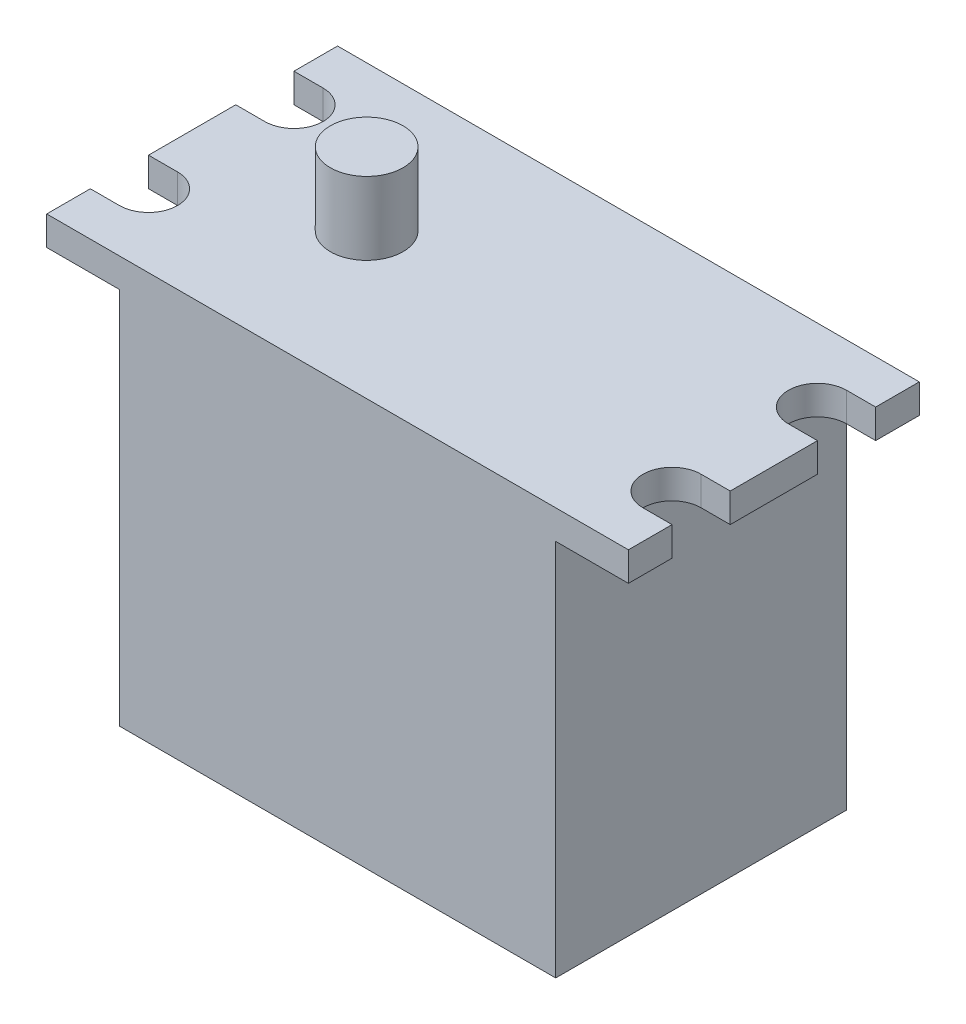
ISO-10303-21;
HEADER;
FILE_DESCRIPTION(('STEP AP214'),'2;1');
FILE_NAME('part.step','',(''),(''),'','','');
FILE_SCHEMA(('AUTOMOTIVE_DESIGN { 1 0 10303 214 1 1 1 1 }'));
ENDSEC;
DATA;
#1=APPLICATION_CONTEXT('core data for automotive mechanical design processes');
#2=APPLICATION_PROTOCOL_DEFINITION('international standard','automotive_design',2000,#1);
#3=PRODUCT_CONTEXT('',#1,'mechanical');
#4=PRODUCT('Part','Part','',(#3));
#5=PRODUCT_RELATED_PRODUCT_CATEGORY('part','',(#4));
#6=PRODUCT_DEFINITION_FORMATION('','',#4);
#7=PRODUCT_DEFINITION_CONTEXT('part definition',#1,'design');
#8=PRODUCT_DEFINITION('design','',#6,#7);
#9=PRODUCT_DEFINITION_SHAPE('','',#8);
#10=(LENGTH_UNIT() NAMED_UNIT(*) SI_UNIT(.MILLI.,.METRE.));
#11=(NAMED_UNIT(*) PLANE_ANGLE_UNIT() SI_UNIT($,.RADIAN.));
#12=(NAMED_UNIT(*) SI_UNIT($,.STERADIAN.) SOLID_ANGLE_UNIT());
#13=UNCERTAINTY_MEASURE_WITH_UNIT(LENGTH_MEASURE(1.E-05),#10,'distance_accuracy_value','');
#14=(GEOMETRIC_REPRESENTATION_CONTEXT(3) GLOBAL_UNCERTAINTY_ASSIGNED_CONTEXT((#13)) GLOBAL_UNIT_ASSIGNED_CONTEXT((#10,
#11,#12)) REPRESENTATION_CONTEXT('',''));
#15=CARTESIAN_POINT('',(0.,0.,0.));
#16=DIRECTION('',(0.,0.,1.));
#17=DIRECTION('',(1.,0.,0.));
#18=AXIS2_PLACEMENT_3D('',#15,#16,#17);
#19=CARTESIAN_POINT('',(12.7,17.78,6.35));
#20=DIRECTION('',(-1.,0.,0.));
#21=DIRECTION('',(0.,0.,1.));
#22=AXIS2_PLACEMENT_3D('',#19,#20,#21);
#23=PLANE('',#22);
#24=DIRECTION('',(0.,0.,-1.));
#25=VECTOR('',#24,1.);
#26=CARTESIAN_POINT('',(12.7,17.78,6.35));
#27=LINE('',#26,#25);
#28=CARTESIAN_POINT('',(12.7,17.78,1.905));
#29=VERTEX_POINT('',#28);
#30=CARTESIAN_POINT('',(12.7,17.78,-1.905));
#31=VERTEX_POINT('',#30);
#32=EDGE_CURVE('E321',#29,#31,#27,.T.);
#33=ORIENTED_EDGE('',*,*,#32,.F.);
#34=DIRECTION('',(0.,1.,0.));
#35=VECTOR('',#34,1.);
#36=CARTESIAN_POINT('',(12.7,0.,1.905));
#37=LINE('',#36,#35);
#38=CARTESIAN_POINT('',(12.7,16.51,1.905));
#39=VERTEX_POINT('',#38);
#40=EDGE_CURVE('E253',#39,#29,#37,.T.);
#41=ORIENTED_EDGE('',*,*,#40,.F.);
#42=DIRECTION('',(0.,0.,1.));
#43=VECTOR('',#42,1.);
#44=CARTESIAN_POINT('',(12.7,16.51,-6.35));
#45=LINE('',#44,#43);
#46=CARTESIAN_POINT('',(12.7,16.51,-1.905));
#47=VERTEX_POINT('',#46);
#48=EDGE_CURVE('E303',#47,#39,#45,.T.);
#49=ORIENTED_EDGE('',*,*,#48,.F.);
#50=DIRECTION('',(0.,1.,0.));
#51=VECTOR('',#50,1.);
#52=CARTESIAN_POINT('',(12.7,0.,-1.905));
#53=LINE('',#52,#51);
#54=EDGE_CURVE('E56',#47,#31,#53,.T.);
#55=ORIENTED_EDGE('',*,*,#54,.T.);
#56=EDGE_LOOP('',(#33,#41,#49,#55));
#57=FACE_BOUND('',#56,.T.);
#58=ADVANCED_FACE('F33',(#57),#23,.F.);
#59=CARTESIAN_POINT('',(12.7,17.78,-4.445));
#60=VERTEX_POINT('',#59);
#61=CARTESIAN_POINT('',(12.7,17.78,-6.35));
#62=VERTEX_POINT('',#61);
#63=EDGE_CURVE('E322',#60,#62,#27,.T.);
#64=ORIENTED_EDGE('',*,*,#63,.F.);
#65=DIRECTION('',(0.,1.,0.));
#66=VECTOR('',#65,1.);
#67=CARTESIAN_POINT('',(12.7,0.,-4.445));
#68=LINE('',#67,#66);
#69=CARTESIAN_POINT('',(12.7,16.51,-4.445));
#70=VERTEX_POINT('',#69);
#71=EDGE_CURVE('E239',#70,#60,#68,.T.);
#72=ORIENTED_EDGE('',*,*,#71,.F.);
#73=CARTESIAN_POINT('',(12.7,16.51,-6.35));
#74=VERTEX_POINT('',#73);
#75=EDGE_CURVE('E299',#74,#70,#45,.T.);
#76=ORIENTED_EDGE('',*,*,#75,.F.);
#77=DIRECTION('',(0.,-1.,0.));
#78=VECTOR('',#77,1.);
#79=CARTESIAN_POINT('',(12.7,17.78,-6.35));
#80=LINE('',#79,#78);
#81=EDGE_CURVE('E343',#62,#74,#80,.T.);
#82=ORIENTED_EDGE('',*,*,#81,.F.);
#83=EDGE_LOOP('',(#64,#72,#76,#82));
#84=FACE_BOUND('',#83,.T.);
#85=ADVANCED_FACE('F430',(#84),#23,.F.);
#86=CARTESIAN_POINT('',(-12.7,17.78,6.35));
#87=DIRECTION('',(1.,0.,0.));
#88=DIRECTION('',(0.,0.,-1.));
#89=AXIS2_PLACEMENT_3D('',#86,#87,#88);
#90=PLANE('',#89);
#91=DIRECTION('',(0.,0.,1.));
#92=VECTOR('',#91,1.);
#93=CARTESIAN_POINT('',(-12.7,17.78,6.35));
#94=LINE('',#93,#92);
#95=CARTESIAN_POINT('',(-12.7,17.78,-1.905));
#96=VERTEX_POINT('',#95);
#97=CARTESIAN_POINT('',(-12.7,17.78,1.905));
#98=VERTEX_POINT('',#97);
#99=EDGE_CURVE('E327',#96,#98,#94,.T.);
#100=ORIENTED_EDGE('',*,*,#99,.F.);
#101=DIRECTION('',(0.,1.,0.));
#102=VECTOR('',#101,1.);
#103=CARTESIAN_POINT('',(-12.7,0.,-1.905));
#104=LINE('',#103,#102);
#105=CARTESIAN_POINT('',(-12.7,16.51,-1.905));
#106=VERTEX_POINT('',#105);
#107=EDGE_CURVE('E225',#106,#96,#104,.T.);
#108=ORIENTED_EDGE('',*,*,#107,.F.);
#109=DIRECTION('',(0.,0.,-1.));
#110=VECTOR('',#109,1.);
#111=CARTESIAN_POINT('',(-12.7,16.51,-6.35));
#112=LINE('',#111,#110);
#113=CARTESIAN_POINT('',(-12.7,16.51,1.905));
#114=VERTEX_POINT('',#113);
#115=EDGE_CURVE('E281',#114,#106,#112,.T.);
#116=ORIENTED_EDGE('',*,*,#115,.F.);
#117=DIRECTION('',(0.,1.,0.));
#118=VECTOR('',#117,1.);
#119=CARTESIAN_POINT('',(-12.7,0.,1.905));
#120=LINE('',#119,#118);
#121=EDGE_CURVE('E270',#114,#98,#120,.T.);
#122=ORIENTED_EDGE('',*,*,#121,.T.);
#123=EDGE_LOOP('',(#100,#108,#116,#122));
#124=FACE_BOUND('',#123,.T.);
#125=ADVANCED_FACE('F447',(#124),#90,.F.);
#126=CARTESIAN_POINT('',(-12.7,17.78,4.445));
#127=VERTEX_POINT('',#126);
#128=CARTESIAN_POINT('',(-12.7,17.78,6.35));
#129=VERTEX_POINT('',#128);
#130=EDGE_CURVE('E324',#127,#129,#94,.T.);
#131=ORIENTED_EDGE('',*,*,#130,.F.);
#132=DIRECTION('',(0.,1.,0.));
#133=VECTOR('',#132,1.);
#134=CARTESIAN_POINT('',(-12.7,0.,4.445));
#135=LINE('',#134,#133);
#136=CARTESIAN_POINT('',(-12.7,16.51,4.445));
#137=VERTEX_POINT('',#136);
#138=EDGE_CURVE('E268',#137,#127,#135,.T.);
#139=ORIENTED_EDGE('',*,*,#138,.F.);
#140=CARTESIAN_POINT('',(-12.7,16.51,6.35));
#141=VERTEX_POINT('',#140);
#142=EDGE_CURVE('E277',#141,#137,#112,.T.);
#143=ORIENTED_EDGE('',*,*,#142,.F.);
#144=DIRECTION('',(0.,-1.,0.));
#145=VECTOR('',#144,1.);
#146=CARTESIAN_POINT('',(-12.7,17.78,6.35));
#147=LINE('',#146,#145);
#148=EDGE_CURVE('E337',#129,#141,#147,.T.);
#149=ORIENTED_EDGE('',*,*,#148,.F.);
#150=EDGE_LOOP('',(#131,#139,#143,#149));
#151=FACE_BOUND('',#150,.T.);
#152=ADVANCED_FACE('F403',(#151),#90,.F.);
#153=CARTESIAN_POINT('',(12.7,16.51,4.445));
#154=VERTEX_POINT('',#153);
#155=CARTESIAN_POINT('',(12.7,16.51,6.35));
#156=VERTEX_POINT('',#155);
#157=EDGE_CURVE('E304',#154,#156,#45,.T.);
#158=ORIENTED_EDGE('',*,*,#157,.F.);
#159=DIRECTION('',(0.,1.,0.));
#160=VECTOR('',#159,1.);
#161=CARTESIAN_POINT('',(12.7,0.,4.445));
#162=LINE('',#161,#160);
#163=CARTESIAN_POINT('',(12.7,17.78,4.445));
#164=VERTEX_POINT('',#163);
#165=EDGE_CURVE('E48',#154,#164,#162,.T.);
#166=ORIENTED_EDGE('',*,*,#165,.T.);
#167=CARTESIAN_POINT('',(12.7,17.78,6.35));
#168=VERTEX_POINT('',#167);
#169=EDGE_CURVE('E317',#168,#164,#27,.T.);
#170=ORIENTED_EDGE('',*,*,#169,.F.);
#171=DIRECTION('',(0.,-1.,0.));
#172=VECTOR('',#171,1.);
#173=CARTESIAN_POINT('',(12.7,17.78,6.35));
#174=LINE('',#173,#172);
#175=EDGE_CURVE('E329',#168,#156,#174,.T.);
#176=ORIENTED_EDGE('',*,*,#175,.T.);
#177=EDGE_LOOP('',(#158,#166,#170,#176));
#178=FACE_BOUND('',#177,.T.);
#179=ADVANCED_FACE('F35',(#178),#23,.F.);
#180=CARTESIAN_POINT('',(-12.7,17.78,-6.35));
#181=DIRECTION('',(0.,0.,1.));
#182=DIRECTION('',(1.,0.,0.));
#183=AXIS2_PLACEMENT_3D('',#180,#181,#182);
#184=PLANE('',#183);
#185=DIRECTION('',(-1.,0.,0.));
#186=VECTOR('',#185,1.);
#187=CARTESIAN_POINT('',(-12.7,0.,-6.35));
#188=LINE('',#187,#186);
#189=CARTESIAN_POINT('',(9.525,0.,-6.35));
#190=VERTEX_POINT('',#189);
#191=CARTESIAN_POINT('',(-9.525,0.,-6.35));
#192=VERTEX_POINT('',#191);
#193=EDGE_CURVE('E297',#190,#192,#188,.T.);
#194=ORIENTED_EDGE('',*,*,#193,.T.);
#195=DIRECTION('',(0.,-1.,0.));
#196=VECTOR('',#195,1.);
#197=CARTESIAN_POINT('',(-9.525,16.51,-6.35));
#198=LINE('',#197,#196);
#199=CARTESIAN_POINT('',(-9.525,16.51,-6.35));
#200=VERTEX_POINT('',#199);
#201=EDGE_CURVE('E290',#200,#192,#198,.T.);
#202=ORIENTED_EDGE('',*,*,#201,.F.);
#203=DIRECTION('',(1.,0.,0.));
#204=VECTOR('',#203,1.);
#205=CARTESIAN_POINT('',(-12.7,16.51,-6.35));
#206=LINE('',#205,#204);
#207=CARTESIAN_POINT('',(-12.7,16.51,-6.35));
#208=VERTEX_POINT('',#207);
#209=EDGE_CURVE('E280',#208,#200,#206,.T.);
#210=ORIENTED_EDGE('',*,*,#209,.F.);
#211=DIRECTION('',(0.,-1.,0.));
#212=VECTOR('',#211,1.);
#213=CARTESIAN_POINT('',(-12.7,17.78,-6.35));
#214=LINE('',#213,#212);
#215=CARTESIAN_POINT('',(-12.7,17.78,-6.35));
#216=VERTEX_POINT('',#215);
#217=EDGE_CURVE('E340',#216,#208,#214,.T.);
#218=ORIENTED_EDGE('',*,*,#217,.F.);
#219=DIRECTION('',(-1.,0.,0.));
#220=VECTOR('',#219,1.);
#221=CARTESIAN_POINT('',(-12.7,17.78,-6.35));
#222=LINE('',#221,#220);
#223=EDGE_CURVE('E320',#62,#216,#222,.T.);
#224=ORIENTED_EDGE('',*,*,#223,.F.);
#225=ORIENTED_EDGE('',*,*,#81,.T.);
#226=DIRECTION('',(1.,0.,0.));
#227=VECTOR('',#226,1.);
#228=CARTESIAN_POINT('',(12.7,16.51,-6.35));
#229=LINE('',#228,#227);
#230=CARTESIAN_POINT('',(9.525,16.51,-6.35));
#231=VERTEX_POINT('',#230);
#232=EDGE_CURVE('E310',#231,#74,#229,.T.);
#233=ORIENTED_EDGE('',*,*,#232,.F.);
#234=DIRECTION('',(0.,-1.,0.));
#235=VECTOR('',#234,1.);
#236=CARTESIAN_POINT('',(9.525,16.51,-6.35));
#237=LINE('',#236,#235);
#238=EDGE_CURVE('E293',#231,#190,#237,.T.);
#239=ORIENTED_EDGE('',*,*,#238,.T.);
#240=EDGE_LOOP('',(#194,#202,#210,#218,#224,#225,#233,#239));
#241=FACE_BOUND('',#240,.T.);
#242=ADVANCED_FACE('F422',(#241),#184,.F.);
#243=CARTESIAN_POINT('',(-12.7,16.51,-4.445));
#244=VERTEX_POINT('',#243);
#245=EDGE_CURVE('E282',#244,#208,#112,.T.);
#246=ORIENTED_EDGE('',*,*,#245,.F.);
#247=DIRECTION('',(0.,1.,0.));
#248=VECTOR('',#247,1.);
#249=CARTESIAN_POINT('',(-12.7,0.,-4.445));
#250=LINE('',#249,#248);
#251=CARTESIAN_POINT('',(-12.7,17.78,-4.445));
#252=VERTEX_POINT('',#251);
#253=EDGE_CURVE('E202',#244,#252,#250,.T.);
#254=ORIENTED_EDGE('',*,*,#253,.T.);
#255=EDGE_CURVE('E219',#216,#252,#94,.T.);
#256=ORIENTED_EDGE('',*,*,#255,.F.);
#257=ORIENTED_EDGE('',*,*,#217,.T.);
#258=EDGE_LOOP('',(#246,#254,#256,#257));
#259=FACE_BOUND('',#258,.T.);
#260=ADVANCED_FACE('F453',(#259),#90,.F.);
#261=CARTESIAN_POINT('',(-12.7,17.78,6.35));
#262=DIRECTION('',(0.,0.,-1.));
#263=DIRECTION('',(-1.,0.,0.));
#264=AXIS2_PLACEMENT_3D('',#261,#262,#263);
#265=PLANE('',#264);
#266=DIRECTION('',(-1.,0.,0.));
#267=VECTOR('',#266,1.);
#268=CARTESIAN_POINT('',(-12.7,16.51,6.35));
#269=LINE('',#268,#267);
#270=CARTESIAN_POINT('',(-9.525,16.51,6.35));
#271=VERTEX_POINT('',#270);
#272=EDGE_CURVE('E288',#271,#141,#269,.T.);
#273=ORIENTED_EDGE('',*,*,#272,.F.);
#274=DIRECTION('',(0.,-1.,0.));
#275=VECTOR('',#274,1.);
#276=CARTESIAN_POINT('',(-9.525,16.51,6.35));
#277=LINE('',#276,#275);
#278=CARTESIAN_POINT('',(-9.525,0.,6.35));
#279=VERTEX_POINT('',#278);
#280=EDGE_CURVE('E294',#271,#279,#277,.T.);
#281=ORIENTED_EDGE('',*,*,#280,.T.);
#282=DIRECTION('',(1.,0.,0.));
#283=VECTOR('',#282,1.);
#284=CARTESIAN_POINT('',(-12.7,0.,6.35));
#285=LINE('',#284,#283);
#286=CARTESIAN_POINT('',(9.525,0.,6.35));
#287=VERTEX_POINT('',#286);
#288=EDGE_CURVE('E332',#279,#287,#285,.T.);
#289=ORIENTED_EDGE('',*,*,#288,.T.);
#290=DIRECTION('',(0.,-1.,0.));
#291=VECTOR('',#290,1.);
#292=CARTESIAN_POINT('',(9.525,16.51,6.35));
#293=LINE('',#292,#291);
#294=CARTESIAN_POINT('',(9.525,16.51,6.35));
#295=VERTEX_POINT('',#294);
#296=EDGE_CURVE('E312',#295,#287,#293,.T.);
#297=ORIENTED_EDGE('',*,*,#296,.F.);
#298=DIRECTION('',(-1.,0.,0.));
#299=VECTOR('',#298,1.);
#300=CARTESIAN_POINT('',(12.7,16.51,6.35));
#301=LINE('',#300,#299);
#302=EDGE_CURVE('E302',#156,#295,#301,.T.);
#303=ORIENTED_EDGE('',*,*,#302,.F.);
#304=ORIENTED_EDGE('',*,*,#175,.F.);
#305=DIRECTION('',(1.,0.,0.));
#306=VECTOR('',#305,1.);
#307=CARTESIAN_POINT('',(-12.7,17.78,6.35));
#308=LINE('',#307,#306);
#309=EDGE_CURVE('E326',#129,#168,#308,.T.);
#310=ORIENTED_EDGE('',*,*,#309,.F.);
#311=ORIENTED_EDGE('',*,*,#148,.T.);
#312=EDGE_LOOP('',(#273,#281,#289,#297,#303,#304,#310,#311));
#313=FACE_BOUND('',#312,.T.);
#314=ADVANCED_FACE('F394',(#313),#265,.F.);
#315=CARTESIAN_POINT('',(0.,17.78,0.));
#316=DIRECTION('',(0.,-1.,0.));
#317=DIRECTION('',(0.,0.,-1.));
#318=AXIS2_PLACEMENT_3D('',#315,#316,#317);
#319=PLANE('',#318);
#320=CARTESIAN_POINT('',(-5.08,17.78,0.));
#321=DIRECTION('',(0.,-1.,0.));
#322=DIRECTION('',(0.,0.,-1.));
#323=AXIS2_PLACEMENT_3D('',#320,#321,#322);
#324=CIRCLE('',#323,1.5875);
#325=CARTESIAN_POINT('',(-5.08,17.78,-1.5875));
#326=VERTEX_POINT('',#325);
#327=EDGE_CURVE('E346',#326,#326,#324,.F.);
#328=ORIENTED_EDGE('',*,*,#327,.F.);
#329=EDGE_LOOP('',(#328));
#330=FACE_BOUND('',#329,.T.);
#331=CARTESIAN_POINT('',(11.43,17.78,3.175));
#332=DIRECTION('',(0.,1.,0.));
#333=DIRECTION('',(0.,0.,-1.));
#334=AXIS2_PLACEMENT_3D('',#331,#332,#333);
#335=CIRCLE('',#334,1.27);
#336=CARTESIAN_POINT('',(11.43,17.78,1.905));
#337=VERTEX_POINT('',#336);
#338=CARTESIAN_POINT('',(11.43,17.78,4.445));
#339=VERTEX_POINT('',#338);
#340=EDGE_CURVE('E243',#337,#339,#335,.T.);
#341=ORIENTED_EDGE('',*,*,#340,.F.);
#342=DIRECTION('',(-1.,0.,0.));
#343=VECTOR('',#342,1.);
#344=CARTESIAN_POINT('',(12.7,17.78,1.905));
#345=LINE('',#344,#343);
#346=EDGE_CURVE('E248',#29,#337,#345,.T.);
#347=ORIENTED_EDGE('',*,*,#346,.F.);
#348=ORIENTED_EDGE('',*,*,#32,.T.);
#349=DIRECTION('',(1.,0.,0.));
#350=VECTOR('',#349,1.);
#351=CARTESIAN_POINT('',(11.43,17.78,-1.905));
#352=LINE('',#351,#350);
#353=CARTESIAN_POINT('',(11.43,17.78,-1.905));
#354=VERTEX_POINT('',#353);
#355=EDGE_CURVE('E231',#354,#31,#352,.T.);
#356=ORIENTED_EDGE('',*,*,#355,.F.);
#357=CARTESIAN_POINT('',(11.43,17.78,-3.175));
#358=DIRECTION('',(0.,1.,0.));
#359=DIRECTION('',(0.,0.,-1.));
#360=AXIS2_PLACEMENT_3D('',#357,#358,#359);
#361=CIRCLE('',#360,1.27);
#362=CARTESIAN_POINT('',(11.43,17.78,-4.445));
#363=VERTEX_POINT('',#362);
#364=EDGE_CURVE('E228',#363,#354,#361,.T.);
#365=ORIENTED_EDGE('',*,*,#364,.F.);
#366=DIRECTION('',(-1.,0.,0.));
#367=VECTOR('',#366,1.);
#368=CARTESIAN_POINT('',(12.7,17.78,-4.445));
#369=LINE('',#368,#367);
#370=EDGE_CURVE('E234',#60,#363,#369,.T.);
#371=ORIENTED_EDGE('',*,*,#370,.F.);
#372=ORIENTED_EDGE('',*,*,#63,.T.);
#373=ORIENTED_EDGE('',*,*,#223,.T.);
#374=ORIENTED_EDGE('',*,*,#255,.T.);
#375=DIRECTION('',(-1.,0.,0.));
#376=VECTOR('',#375,1.);
#377=CARTESIAN_POINT('',(-12.7,17.78,-4.445));
#378=LINE('',#377,#376);
#379=CARTESIAN_POINT('',(-11.43,17.78,-4.445));
#380=VERTEX_POINT('',#379);
#381=EDGE_CURVE('E196',#380,#252,#378,.T.);
#382=ORIENTED_EDGE('',*,*,#381,.F.);
#383=CARTESIAN_POINT('',(-11.43,17.78,-3.175));
#384=DIRECTION('',(0.,1.,0.));
#385=DIRECTION('',(0.,0.,1.));
#386=AXIS2_PLACEMENT_3D('',#383,#384,#385);
#387=CIRCLE('',#386,1.27);
#388=CARTESIAN_POINT('',(-11.43,17.78,-1.905));
#389=VERTEX_POINT('',#388);
#390=EDGE_CURVE('E206',#389,#380,#387,.T.);
#391=ORIENTED_EDGE('',*,*,#390,.F.);
#392=DIRECTION('',(1.,0.,0.));
#393=VECTOR('',#392,1.);
#394=CARTESIAN_POINT('',(-11.43,17.78,-1.905));
#395=LINE('',#394,#393);
#396=EDGE_CURVE('E203',#96,#389,#395,.T.);
#397=ORIENTED_EDGE('',*,*,#396,.F.);
#398=ORIENTED_EDGE('',*,*,#99,.T.);
#399=DIRECTION('',(-1.,0.,0.));
#400=VECTOR('',#399,1.);
#401=CARTESIAN_POINT('',(-12.7,17.78,1.905));
#402=LINE('',#401,#400);
#403=CARTESIAN_POINT('',(-11.43,17.78,1.905));
#404=VERTEX_POINT('',#403);
#405=EDGE_CURVE('E259',#404,#98,#402,.T.);
#406=ORIENTED_EDGE('',*,*,#405,.F.);
#407=CARTESIAN_POINT('',(-11.43,17.78,3.175));
#408=DIRECTION('',(0.,1.,0.));
#409=DIRECTION('',(0.,0.,1.));
#410=AXIS2_PLACEMENT_3D('',#407,#408,#409);
#411=CIRCLE('',#410,1.27);
#412=CARTESIAN_POINT('',(-11.43,17.78,4.445));
#413=VERTEX_POINT('',#412);
#414=EDGE_CURVE('E224',#413,#404,#411,.T.);
#415=ORIENTED_EDGE('',*,*,#414,.F.);
#416=DIRECTION('',(1.,0.,0.));
#417=VECTOR('',#416,1.);
#418=CARTESIAN_POINT('',(-11.43,17.78,4.445));
#419=LINE('',#418,#417);
#420=EDGE_CURVE('E261',#127,#413,#419,.T.);
#421=ORIENTED_EDGE('',*,*,#420,.F.);
#422=ORIENTED_EDGE('',*,*,#130,.T.);
#423=ORIENTED_EDGE('',*,*,#309,.T.);
#424=ORIENTED_EDGE('',*,*,#169,.T.);
#425=DIRECTION('',(1.,0.,0.));
#426=VECTOR('',#425,1.);
#427=CARTESIAN_POINT('',(11.43,17.78,4.445));
#428=LINE('',#427,#426);
#429=EDGE_CURVE('E246',#339,#164,#428,.T.);
#430=ORIENTED_EDGE('',*,*,#429,.F.);
#431=EDGE_LOOP('',(#341,#347,#348,#356,#365,#371,#372,#373,#374,#382,#391,#397,#398,#406,#415,
#421,#422,#423,#424,#430));
#432=FACE_BOUND('',#431,.T.);
#433=ADVANCED_FACE('F217',(#330,#432),#319,.F.);
#434=CARTESIAN_POINT('',(0.,0.,0.));
#435=DIRECTION('',(0.,-1.,0.));
#436=DIRECTION('',(0.,0.,-1.));
#437=AXIS2_PLACEMENT_3D('',#434,#435,#436);
#438=PLANE('',#437);
#439=DIRECTION('',(0.,0.,1.));
#440=VECTOR('',#439,1.);
#441=CARTESIAN_POINT('',(-9.525,0.,-6.35));
#442=LINE('',#441,#440);
#443=EDGE_CURVE('E291',#192,#279,#442,.T.);
#444=ORIENTED_EDGE('',*,*,#443,.F.);
#445=ORIENTED_EDGE('',*,*,#193,.F.);
#446=DIRECTION('',(0.,0.,-1.));
#447=VECTOR('',#446,1.);
#448=CARTESIAN_POINT('',(9.525,0.,-6.35));
#449=LINE('',#448,#447);
#450=EDGE_CURVE('E276',#287,#190,#449,.T.);
#451=ORIENTED_EDGE('',*,*,#450,.F.);
#452=ORIENTED_EDGE('',*,*,#288,.F.);
#453=EDGE_LOOP('',(#444,#445,#451,#452));
#454=FACE_BOUND('',#453,.T.);
#455=ADVANCED_FACE('F416',(#454),#438,.T.);
#456=CARTESIAN_POINT('',(9.525,16.51,-6.35));
#457=DIRECTION('',(-1.,0.,0.));
#458=DIRECTION('',(0.,0.,1.));
#459=AXIS2_PLACEMENT_3D('',#456,#457,#458);
#460=PLANE('',#459);
#461=ORIENTED_EDGE('',*,*,#450,.T.);
#462=ORIENTED_EDGE('',*,*,#238,.F.);
#463=DIRECTION('',(0.,0.,-1.));
#464=VECTOR('',#463,1.);
#465=CARTESIAN_POINT('',(9.525,16.51,-6.35));
#466=LINE('',#465,#464);
#467=EDGE_CURVE('E307',#295,#231,#466,.T.);
#468=ORIENTED_EDGE('',*,*,#467,.F.);
#469=ORIENTED_EDGE('',*,*,#296,.T.);
#470=EDGE_LOOP('',(#461,#462,#468,#469));
#471=FACE_BOUND('',#470,.T.);
#472=ADVANCED_FACE('F419',(#471),#460,.F.);
#473=CARTESIAN_POINT('',(0.,16.51,0.));
#474=DIRECTION('',(0.,-1.,0.));
#475=DIRECTION('',(0.,0.,-1.));
#476=AXIS2_PLACEMENT_3D('',#473,#474,#475);
#477=PLANE('',#476);
#478=DIRECTION('',(1.,0.,0.));
#479=VECTOR('',#478,1.);
#480=CARTESIAN_POINT('',(0.,16.51,1.905));
#481=LINE('',#480,#479);
#482=CARTESIAN_POINT('',(11.43,16.51,1.905));
#483=VERTEX_POINT('',#482);
#484=EDGE_CURVE('E11',#483,#39,#481,.T.);
#485=ORIENTED_EDGE('',*,*,#484,.F.);
#486=CARTESIAN_POINT('',(11.43,16.51,3.175));
#487=DIRECTION('',(0.,-1.,0.));
#488=DIRECTION('',(0.,0.,-1.));
#489=AXIS2_PLACEMENT_3D('',#486,#487,#488);
#490=CIRCLE('',#489,1.27);
#491=CARTESIAN_POINT('',(11.43,16.51,4.445));
#492=VERTEX_POINT('',#491);
#493=EDGE_CURVE('E41',#492,#483,#490,.T.);
#494=ORIENTED_EDGE('',*,*,#493,.F.);
#495=DIRECTION('',(-1.,0.,0.));
#496=VECTOR('',#495,1.);
#497=CARTESIAN_POINT('',(0.,16.51,4.445));
#498=LINE('',#497,#496);
#499=EDGE_CURVE('E370',#154,#492,#498,.T.);
#500=ORIENTED_EDGE('',*,*,#499,.F.);
#501=ORIENTED_EDGE('',*,*,#157,.T.);
#502=ORIENTED_EDGE('',*,*,#302,.T.);
#503=ORIENTED_EDGE('',*,*,#467,.T.);
#504=ORIENTED_EDGE('',*,*,#232,.T.);
#505=ORIENTED_EDGE('',*,*,#75,.T.);
#506=DIRECTION('',(1.,0.,0.));
#507=VECTOR('',#506,1.);
#508=CARTESIAN_POINT('',(0.,16.51,-4.445));
#509=LINE('',#508,#507);
#510=CARTESIAN_POINT('',(11.43,16.51,-4.445));
#511=VERTEX_POINT('',#510);
#512=EDGE_CURVE('E368',#511,#70,#509,.T.);
#513=ORIENTED_EDGE('',*,*,#512,.F.);
#514=CARTESIAN_POINT('',(11.43,16.51,-3.175));
#515=DIRECTION('',(0.,-1.,0.));
#516=DIRECTION('',(0.,0.,-1.));
#517=AXIS2_PLACEMENT_3D('',#514,#515,#516);
#518=CIRCLE('',#517,1.27);
#519=CARTESIAN_POINT('',(11.43,16.51,-1.905));
#520=VERTEX_POINT('',#519);
#521=EDGE_CURVE('E366',#520,#511,#518,.T.);
#522=ORIENTED_EDGE('',*,*,#521,.F.);
#523=DIRECTION('',(-1.,0.,0.));
#524=VECTOR('',#523,1.);
#525=CARTESIAN_POINT('',(0.,16.51,-1.905));
#526=LINE('',#525,#524);
#527=EDGE_CURVE('E364',#47,#520,#526,.T.);
#528=ORIENTED_EDGE('',*,*,#527,.F.);
#529=ORIENTED_EDGE('',*,*,#48,.T.);
#530=EDGE_LOOP('',(#485,#494,#500,#501,#502,#503,#504,#505,#513,#522,#528,#529));
#531=FACE_BOUND('',#530,.T.);
#532=ADVANCED_FACE('F383',(#531),#477,.T.);
#533=CARTESIAN_POINT('',(-9.525,16.51,-6.35));
#534=DIRECTION('',(1.,0.,0.));
#535=DIRECTION('',(0.,0.,-1.));
#536=AXIS2_PLACEMENT_3D('',#533,#534,#535);
#537=PLANE('',#536);
#538=ORIENTED_EDGE('',*,*,#443,.T.);
#539=ORIENTED_EDGE('',*,*,#280,.F.);
#540=DIRECTION('',(0.,0.,1.));
#541=VECTOR('',#540,1.);
#542=CARTESIAN_POINT('',(-9.525,16.51,-6.35));
#543=LINE('',#542,#541);
#544=EDGE_CURVE('E285',#200,#271,#543,.T.);
#545=ORIENTED_EDGE('',*,*,#544,.F.);
#546=ORIENTED_EDGE('',*,*,#201,.T.);
#547=EDGE_LOOP('',(#538,#539,#545,#546));
#548=FACE_BOUND('',#547,.T.);
#549=ADVANCED_FACE('F411',(#548),#537,.F.);
#550=CARTESIAN_POINT('',(0.,16.51,0.));
#551=DIRECTION('',(0.,1.,0.));
#552=DIRECTION('',(0.,0.,1.));
#553=AXIS2_PLACEMENT_3D('',#550,#551,#552);
#554=PLANE('',#553);
#555=ORIENTED_EDGE('',*,*,#115,.T.);
#556=DIRECTION('',(1.,0.,0.));
#557=VECTOR('',#556,1.);
#558=CARTESIAN_POINT('',(0.,16.51,-1.905));
#559=LINE('',#558,#557);
#560=CARTESIAN_POINT('',(-11.43,16.51,-1.905));
#561=VERTEX_POINT('',#560);
#562=EDGE_CURVE('E361',#106,#561,#559,.T.);
#563=ORIENTED_EDGE('',*,*,#562,.T.);
#564=CARTESIAN_POINT('',(-11.43,16.51,-3.175));
#565=DIRECTION('',(0.,1.,0.));
#566=DIRECTION('',(0.,0.,1.));
#567=AXIS2_PLACEMENT_3D('',#564,#565,#566);
#568=CIRCLE('',#567,1.27);
#569=CARTESIAN_POINT('',(-11.43,16.51,-4.445));
#570=VERTEX_POINT('',#569);
#571=EDGE_CURVE('E359',#561,#570,#568,.T.);
#572=ORIENTED_EDGE('',*,*,#571,.T.);
#573=DIRECTION('',(-1.,0.,0.));
#574=VECTOR('',#573,1.);
#575=CARTESIAN_POINT('',(0.,16.51,-4.445));
#576=LINE('',#575,#574);
#577=EDGE_CURVE('E199',#570,#244,#576,.T.);
#578=ORIENTED_EDGE('',*,*,#577,.T.);
#579=ORIENTED_EDGE('',*,*,#245,.T.);
#580=ORIENTED_EDGE('',*,*,#209,.T.);
#581=ORIENTED_EDGE('',*,*,#544,.T.);
#582=ORIENTED_EDGE('',*,*,#272,.T.);
#583=ORIENTED_EDGE('',*,*,#142,.T.);
#584=DIRECTION('',(1.,0.,0.));
#585=VECTOR('',#584,1.);
#586=CARTESIAN_POINT('',(0.,16.51,4.445));
#587=LINE('',#586,#585);
#588=CARTESIAN_POINT('',(-11.43,16.51,4.445));
#589=VERTEX_POINT('',#588);
#590=EDGE_CURVE('E355',#137,#589,#587,.T.);
#591=ORIENTED_EDGE('',*,*,#590,.T.);
#592=CARTESIAN_POINT('',(-11.43,16.51,3.175));
#593=DIRECTION('',(0.,1.,0.));
#594=DIRECTION('',(0.,0.,1.));
#595=AXIS2_PLACEMENT_3D('',#592,#593,#594);
#596=CIRCLE('',#595,1.27);
#597=CARTESIAN_POINT('',(-11.43,16.51,1.905));
#598=VERTEX_POINT('',#597);
#599=EDGE_CURVE('E352',#589,#598,#596,.T.);
#600=ORIENTED_EDGE('',*,*,#599,.T.);
#601=DIRECTION('',(-1.,0.,0.));
#602=VECTOR('',#601,1.);
#603=CARTESIAN_POINT('',(0.,16.51,1.905));
#604=LINE('',#603,#602);
#605=EDGE_CURVE('E349',#598,#114,#604,.T.);
#606=ORIENTED_EDGE('',*,*,#605,.T.);
#607=EDGE_LOOP('',(#555,#563,#572,#578,#579,#580,#581,#582,#583,#591,#600,#606));
#608=FACE_BOUND('',#607,.T.);
#609=ADVANCED_FACE('F407',(#608),#554,.F.);
#610=CARTESIAN_POINT('',(-5.08,20.955,0.));
#611=DIRECTION('',(0.,-1.,0.));
#612=DIRECTION('',(0.,0.,-1.));
#613=AXIS2_PLACEMENT_3D('',#610,#611,#612);
#614=CYLINDRICAL_SURFACE('',#613,1.5875);
#615=CARTESIAN_POINT('',(-5.08,20.955,0.));
#616=DIRECTION('',(0.,1.,0.));
#617=DIRECTION('',(0.,0.,1.));
#618=AXIS2_PLACEMENT_3D('',#615,#616,#617);
#619=CIRCLE('',#618,1.5875);
#620=CARTESIAN_POINT('',(-5.08,20.955,1.5875));
#621=VERTEX_POINT('',#620);
#622=EDGE_CURVE('E267',#621,#621,#619,.T.);
#623=ORIENTED_EDGE('',*,*,#622,.F.);
#624=EDGE_LOOP('',(#623));
#625=FACE_BOUND('',#624,.T.);
#626=ORIENTED_EDGE('',*,*,#327,.T.);
#627=EDGE_LOOP('',(#626));
#628=FACE_BOUND('',#627,.T.);
#629=ADVANCED_FACE('F497',(#625,#628),#614,.T.);
#630=CARTESIAN_POINT('',(-5.08,20.955,0.));
#631=DIRECTION('',(0.,1.,0.));
#632=DIRECTION('',(0.,0.,1.));
#633=AXIS2_PLACEMENT_3D('',#630,#631,#632);
#634=PLANE('',#633);
#635=ORIENTED_EDGE('',*,*,#622,.T.);
#636=EDGE_LOOP('',(#635));
#637=FACE_BOUND('',#636,.T.);
#638=ADVANCED_FACE('F490',(#637),#634,.T.);
#639=CARTESIAN_POINT('',(-11.43,0.,3.175));
#640=DIRECTION('',(0.,1.,0.));
#641=DIRECTION('',(0.,0.,1.));
#642=AXIS2_PLACEMENT_3D('',#639,#640,#641);
#643=CYLINDRICAL_SURFACE('',#642,1.27);
#644=DIRECTION('',(0.,1.,0.));
#645=VECTOR('',#644,1.);
#646=CARTESIAN_POINT('',(-11.43,0.,4.445));
#647=LINE('',#646,#645);
#648=EDGE_CURVE('E265',#589,#413,#647,.T.);
#649=ORIENTED_EDGE('',*,*,#648,.T.);
#650=ORIENTED_EDGE('',*,*,#414,.T.);
#651=DIRECTION('',(0.,1.,0.));
#652=VECTOR('',#651,1.);
#653=CARTESIAN_POINT('',(-11.43,0.,1.905));
#654=LINE('',#653,#652);
#655=EDGE_CURVE('E264',#598,#404,#654,.T.);
#656=ORIENTED_EDGE('',*,*,#655,.F.);
#657=ORIENTED_EDGE('',*,*,#599,.F.);
#658=EDGE_LOOP('',(#649,#650,#656,#657));
#659=FACE_BOUND('',#658,.T.);
#660=ADVANCED_FACE('F479',(#659),#643,.F.);
#661=CARTESIAN_POINT('',(-11.43,0.,4.445));
#662=DIRECTION('',(0.,0.,1.));
#663=DIRECTION('',(1.,0.,0.));
#664=AXIS2_PLACEMENT_3D('',#661,#662,#663);
#665=PLANE('',#664);
#666=ORIENTED_EDGE('',*,*,#138,.T.);
#667=ORIENTED_EDGE('',*,*,#420,.T.);
#668=ORIENTED_EDGE('',*,*,#648,.F.);
#669=ORIENTED_EDGE('',*,*,#590,.F.);
#670=EDGE_LOOP('',(#666,#667,#668,#669));
#671=FACE_BOUND('',#670,.T.);
#672=ADVANCED_FACE('F482',(#671),#665,.F.);
#673=CARTESIAN_POINT('',(-12.7,0.,1.905));
#674=DIRECTION('',(0.,0.,-1.));
#675=DIRECTION('',(-1.,0.,0.));
#676=AXIS2_PLACEMENT_3D('',#673,#674,#675);
#677=PLANE('',#676);
#678=ORIENTED_EDGE('',*,*,#655,.T.);
#679=ORIENTED_EDGE('',*,*,#405,.T.);
#680=ORIENTED_EDGE('',*,*,#121,.F.);
#681=ORIENTED_EDGE('',*,*,#605,.F.);
#682=EDGE_LOOP('',(#678,#679,#680,#681));
#683=FACE_BOUND('',#682,.T.);
#684=ADVANCED_FACE('F476',(#683),#677,.F.);
#685=CARTESIAN_POINT('',(-11.43,0.,-3.175));
#686=DIRECTION('',(0.,1.,0.));
#687=DIRECTION('',(0.,0.,1.));
#688=AXIS2_PLACEMENT_3D('',#685,#686,#687);
#689=CYLINDRICAL_SURFACE('',#688,1.27);
#690=DIRECTION('',(0.,1.,0.));
#691=VECTOR('',#690,1.);
#692=CARTESIAN_POINT('',(-11.43,0.,-1.905));
#693=LINE('',#692,#691);
#694=EDGE_CURVE('E209',#561,#389,#693,.T.);
#695=ORIENTED_EDGE('',*,*,#694,.T.);
#696=ORIENTED_EDGE('',*,*,#390,.T.);
#697=DIRECTION('',(0.,1.,0.));
#698=VECTOR('',#697,1.);
#699=CARTESIAN_POINT('',(-11.43,0.,-4.445));
#700=LINE('',#699,#698);
#701=EDGE_CURVE('E192',#570,#380,#700,.T.);
#702=ORIENTED_EDGE('',*,*,#701,.F.);
#703=ORIENTED_EDGE('',*,*,#571,.F.);
#704=EDGE_LOOP('',(#695,#696,#702,#703));
#705=FACE_BOUND('',#704,.T.);
#706=ADVANCED_FACE('F207',(#705),#689,.F.);
#707=CARTESIAN_POINT('',(-11.43,0.,-1.905));
#708=DIRECTION('',(0.,0.,1.));
#709=DIRECTION('',(1.,0.,0.));
#710=AXIS2_PLACEMENT_3D('',#707,#708,#709);
#711=PLANE('',#710);
#712=ORIENTED_EDGE('',*,*,#107,.T.);
#713=ORIENTED_EDGE('',*,*,#396,.T.);
#714=ORIENTED_EDGE('',*,*,#694,.F.);
#715=ORIENTED_EDGE('',*,*,#562,.F.);
#716=EDGE_LOOP('',(#712,#713,#714,#715));
#717=FACE_BOUND('',#716,.T.);
#718=ADVANCED_FACE('F472',(#717),#711,.F.);
#719=CARTESIAN_POINT('',(-12.7,0.,-4.445));
#720=DIRECTION('',(0.,0.,-1.));
#721=DIRECTION('',(-1.,0.,0.));
#722=AXIS2_PLACEMENT_3D('',#719,#720,#721);
#723=PLANE('',#722);
#724=ORIENTED_EDGE('',*,*,#701,.T.);
#725=ORIENTED_EDGE('',*,*,#381,.T.);
#726=ORIENTED_EDGE('',*,*,#253,.F.);
#727=ORIENTED_EDGE('',*,*,#577,.F.);
#728=EDGE_LOOP('',(#724,#725,#726,#727));
#729=FACE_BOUND('',#728,.T.);
#730=ADVANCED_FACE('F194',(#729),#723,.F.);
#731=CARTESIAN_POINT('',(11.43,0.,-3.175));
#732=DIRECTION('',(0.,1.,0.));
#733=DIRECTION('',(0.,0.,1.));
#734=AXIS2_PLACEMENT_3D('',#731,#732,#733);
#735=CYLINDRICAL_SURFACE('',#734,1.27);
#736=ORIENTED_EDGE('',*,*,#521,.T.);
#737=DIRECTION('',(0.,1.,0.));
#738=VECTOR('',#737,1.);
#739=CARTESIAN_POINT('',(11.43,0.,-4.445));
#740=LINE('',#739,#738);
#741=EDGE_CURVE('E213',#511,#363,#740,.T.);
#742=ORIENTED_EDGE('',*,*,#741,.T.);
#743=ORIENTED_EDGE('',*,*,#364,.T.);
#744=DIRECTION('',(0.,1.,0.));
#745=VECTOR('',#744,1.);
#746=CARTESIAN_POINT('',(11.43,0.,-1.905));
#747=LINE('',#746,#745);
#748=EDGE_CURVE('E237',#520,#354,#747,.T.);
#749=ORIENTED_EDGE('',*,*,#748,.F.);
#750=EDGE_LOOP('',(#736,#742,#743,#749));
#751=FACE_BOUND('',#750,.T.);
#752=ADVANCED_FACE('F440',(#751),#735,.F.);
#753=CARTESIAN_POINT('',(12.7,0.,-4.445));
#754=DIRECTION('',(0.,0.,-1.));
#755=DIRECTION('',(-1.,0.,0.));
#756=AXIS2_PLACEMENT_3D('',#753,#754,#755);
#757=PLANE('',#756);
#758=ORIENTED_EDGE('',*,*,#512,.T.);
#759=ORIENTED_EDGE('',*,*,#71,.T.);
#760=ORIENTED_EDGE('',*,*,#370,.T.);
#761=ORIENTED_EDGE('',*,*,#741,.F.);
#762=EDGE_LOOP('',(#758,#759,#760,#761));
#763=FACE_BOUND('',#762,.T.);
#764=ADVANCED_FACE('F433',(#763),#757,.F.);
#765=CARTESIAN_POINT('',(11.43,0.,-1.905));
#766=DIRECTION('',(0.,0.,1.));
#767=DIRECTION('',(1.,0.,0.));
#768=AXIS2_PLACEMENT_3D('',#765,#766,#767);
#769=PLANE('',#768);
#770=ORIENTED_EDGE('',*,*,#527,.T.);
#771=ORIENTED_EDGE('',*,*,#748,.T.);
#772=ORIENTED_EDGE('',*,*,#355,.T.);
#773=ORIENTED_EDGE('',*,*,#54,.F.);
#774=EDGE_LOOP('',(#770,#771,#772,#773));
#775=FACE_BOUND('',#774,.T.);
#776=ADVANCED_FACE('F441',(#775),#769,.F.);
#777=CARTESIAN_POINT('',(11.43,0.,3.175));
#778=DIRECTION('',(0.,1.,0.));
#779=DIRECTION('',(0.,0.,1.));
#780=AXIS2_PLACEMENT_3D('',#777,#778,#779);
#781=CYLINDRICAL_SURFACE('',#780,1.27);
#782=ORIENTED_EDGE('',*,*,#493,.T.);
#783=DIRECTION('',(0.,1.,0.));
#784=VECTOR('',#783,1.);
#785=CARTESIAN_POINT('',(11.43,0.,1.905));
#786=LINE('',#785,#784);
#787=EDGE_CURVE('E232',#483,#337,#786,.T.);
#788=ORIENTED_EDGE('',*,*,#787,.T.);
#789=ORIENTED_EDGE('',*,*,#340,.T.);
#790=DIRECTION('',(0.,1.,0.));
#791=VECTOR('',#790,1.);
#792=CARTESIAN_POINT('',(11.43,0.,4.445));
#793=LINE('',#792,#791);
#794=EDGE_CURVE('E251',#492,#339,#793,.T.);
#795=ORIENTED_EDGE('',*,*,#794,.F.);
#796=EDGE_LOOP('',(#782,#788,#789,#795));
#797=FACE_BOUND('',#796,.T.);
#798=ADVANCED_FACE('F375',(#797),#781,.F.);
#799=CARTESIAN_POINT('',(12.7,0.,1.905));
#800=DIRECTION('',(0.,0.,-1.));
#801=DIRECTION('',(-1.,0.,0.));
#802=AXIS2_PLACEMENT_3D('',#799,#800,#801);
#803=PLANE('',#802);
#804=ORIENTED_EDGE('',*,*,#484,.T.);
#805=ORIENTED_EDGE('',*,*,#40,.T.);
#806=ORIENTED_EDGE('',*,*,#346,.T.);
#807=ORIENTED_EDGE('',*,*,#787,.F.);
#808=EDGE_LOOP('',(#804,#805,#806,#807));
#809=FACE_BOUND('',#808,.T.);
#810=ADVANCED_FACE('F379',(#809),#803,.F.);
#811=CARTESIAN_POINT('',(11.43,0.,4.445));
#812=DIRECTION('',(0.,0.,1.));
#813=DIRECTION('',(1.,0.,0.));
#814=AXIS2_PLACEMENT_3D('',#811,#812,#813);
#815=PLANE('',#814);
#816=ORIENTED_EDGE('',*,*,#499,.T.);
#817=ORIENTED_EDGE('',*,*,#794,.T.);
#818=ORIENTED_EDGE('',*,*,#429,.T.);
#819=ORIENTED_EDGE('',*,*,#165,.F.);
#820=EDGE_LOOP('',(#816,#817,#818,#819));
#821=FACE_BOUND('',#820,.T.);
#822=ADVANCED_FACE('F622',(#821),#815,.F.);
#823=CLOSED_SHELL('',(#58,#85,#125,#152,#179,#242,#260,#314,#433,#455,#472,#532,#549,#609,#629,
#638,#660,#672,#684,#706,#718,#730,#752,#764,#776,#798,#810,#822));
#824=MANIFOLD_SOLID_BREP('B2',#823);
#825=ADVANCED_BREP_SHAPE_REPRESENTATION('',(#18,#824),#14);
#826=SHAPE_DEFINITION_REPRESENTATION(#9,#825);
ENDSEC;
END-ISO-10303-21;
